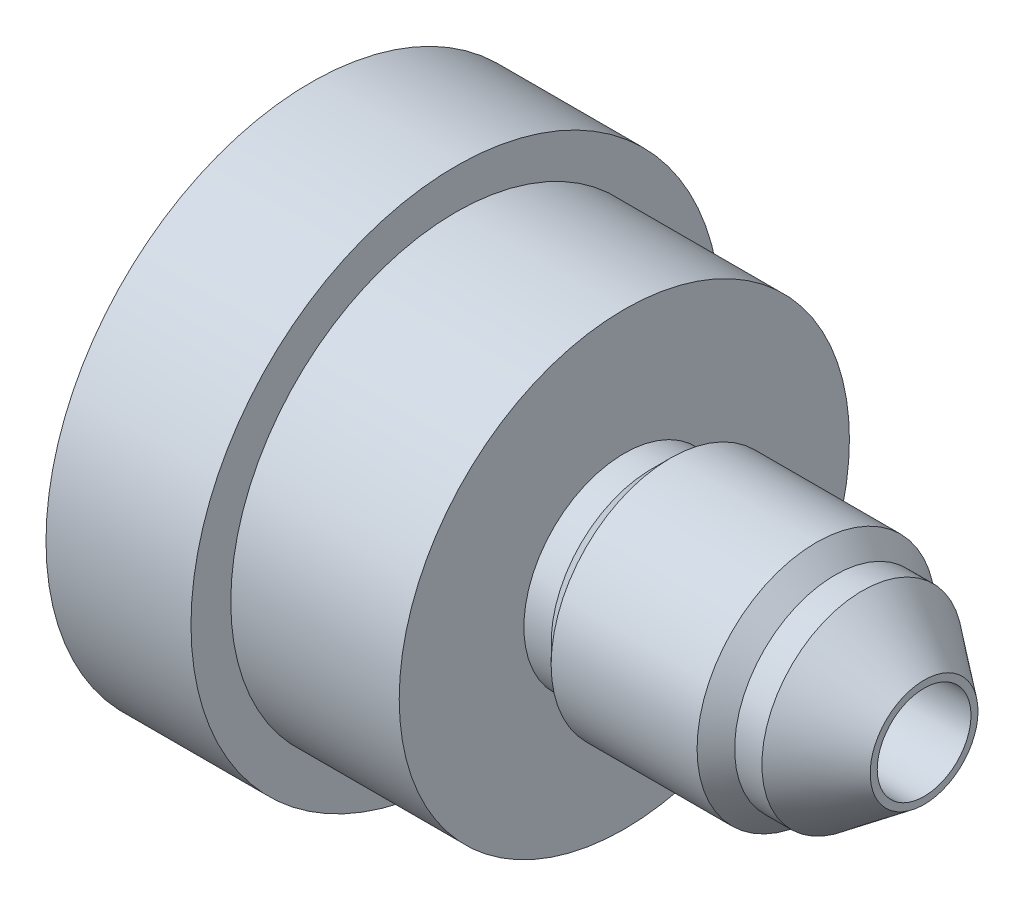
ISO-10303-21;
HEADER;
FILE_DESCRIPTION(('STEP AP214'),'2;1');
FILE_NAME('part.step','',(''),(''),'','','');
FILE_SCHEMA(('AUTOMOTIVE_DESIGN { 1 0 10303 214 1 1 1 1 }'));
ENDSEC;
DATA;
#1=APPLICATION_CONTEXT('core data for automotive mechanical design processes');
#2=APPLICATION_PROTOCOL_DEFINITION('international standard','automotive_design',2000,#1);
#3=PRODUCT_CONTEXT('',#1,'mechanical');
#4=PRODUCT('Part','Part','',(#3));
#5=PRODUCT_RELATED_PRODUCT_CATEGORY('part','',(#4));
#6=PRODUCT_DEFINITION_FORMATION('','',#4);
#7=PRODUCT_DEFINITION_CONTEXT('part definition',#1,'design');
#8=PRODUCT_DEFINITION('design','',#6,#7);
#9=PRODUCT_DEFINITION_SHAPE('','',#8);
#10=(LENGTH_UNIT() NAMED_UNIT(*) SI_UNIT(.MILLI.,.METRE.));
#11=(NAMED_UNIT(*) PLANE_ANGLE_UNIT() SI_UNIT($,.RADIAN.));
#12=(NAMED_UNIT(*) SI_UNIT($,.STERADIAN.) SOLID_ANGLE_UNIT());
#13=UNCERTAINTY_MEASURE_WITH_UNIT(LENGTH_MEASURE(1.E-05),#10,'distance_accuracy_value','');
#14=(GEOMETRIC_REPRESENTATION_CONTEXT(3) GLOBAL_UNCERTAINTY_ASSIGNED_CONTEXT((#13)) GLOBAL_UNIT_ASSIGNED_CONTEXT((#10,
#11,#12)) REPRESENTATION_CONTEXT('',''));
#15=CARTESIAN_POINT('',(0.,0.,0.));
#16=DIRECTION('',(0.,0.,1.));
#17=DIRECTION('',(1.,0.,0.));
#18=AXIS2_PLACEMENT_3D('',#15,#16,#17);
#19=CARTESIAN_POINT('',(-14.2875,0.,0.));
#20=DIRECTION('',(-1.,0.,0.));
#21=DIRECTION('',(0.,0.,1.));
#22=AXIS2_PLACEMENT_3D('',#19,#20,#21);
#23=CYLINDRICAL_SURFACE('',#22,5.55625);
#24=CARTESIAN_POINT('',(2.46318919710472,0.,0.));
#25=DIRECTION('',(1.,0.,0.));
#26=DIRECTION('',(0.,0.,-1.));
#27=AXIS2_PLACEMENT_3D('',#24,#25,#26);
#28=CIRCLE('',#27,5.55625);
#29=CARTESIAN_POINT('',(2.46318919710472,0.,-5.55625));
#30=VERTEX_POINT('',#29);
#31=EDGE_CURVE('E77',#30,#30,#28,.T.);
#32=ORIENTED_EDGE('',*,*,#31,.T.);
#33=EDGE_LOOP('',(#32));
#34=FACE_BOUND('',#33,.T.);
#35=CARTESIAN_POINT('',(9.26411304173335,0.,0.));
#36=DIRECTION('',(1.,0.,0.));
#37=DIRECTION('',(0.,0.,-1.));
#38=AXIS2_PLACEMENT_3D('',#35,#36,#37);
#39=CIRCLE('',#38,5.55625);
#40=CARTESIAN_POINT('',(9.26411304173335,0.,-5.55625));
#41=VERTEX_POINT('',#40);
#42=EDGE_CURVE('E74',#41,#41,#39,.T.);
#43=ORIENTED_EDGE('',*,*,#42,.F.);
#44=EDGE_LOOP('',(#43));
#45=FACE_BOUND('',#44,.T.);
#46=ADVANCED_FACE('F36',(#34,#45),#23,.T.);
#47=CARTESIAN_POINT('',(14.2875,2.1844,0.));
#48=DIRECTION('',(-1.,0.,0.));
#49=DIRECTION('',(0.,0.,1.));
#50=AXIS2_PLACEMENT_3D('',#47,#48,#49);
#51=PLANE('',#50);
#52=CARTESIAN_POINT('',(14.2875,0.,0.));
#53=DIRECTION('',(1.,0.,0.));
#54=DIRECTION('',(0.,0.,-1.));
#55=AXIS2_PLACEMENT_3D('',#52,#53,#54);
#56=CIRCLE('',#55,2.51206);
#57=CARTESIAN_POINT('',(14.2875,0.,-2.51206));
#58=VERTEX_POINT('',#57);
#59=EDGE_CURVE('E65',#58,#58,#56,.T.);
#60=ORIENTED_EDGE('',*,*,#59,.T.);
#61=EDGE_LOOP('',(#60));
#62=FACE_BOUND('',#61,.T.);
#63=CARTESIAN_POINT('',(14.2875,0.,0.));
#64=DIRECTION('',(-1.,0.,0.));
#65=DIRECTION('',(0.,0.,1.));
#66=AXIS2_PLACEMENT_3D('',#63,#64,#65);
#67=CIRCLE('',#66,2.1844);
#68=CARTESIAN_POINT('',(14.2875,0.,2.1844));
#69=VERTEX_POINT('',#68);
#70=EDGE_CURVE('E51',#69,#69,#67,.T.);
#71=ORIENTED_EDGE('',*,*,#70,.T.);
#72=EDGE_LOOP('',(#71));
#73=FACE_BOUND('',#72,.T.);
#74=ADVANCED_FACE('F108',(#62,#73),#51,.F.);
#75=CARTESIAN_POINT('',(-14.2875,0.,0.));
#76=DIRECTION('',(-1.,0.,0.));
#77=DIRECTION('',(0.,0.,1.));
#78=AXIS2_PLACEMENT_3D('',#75,#76,#77);
#79=CYLINDRICAL_SURFACE('',#78,12.3444);
#80=CARTESIAN_POINT('',(-14.2875,0.,0.));
#81=DIRECTION('',(-1.,0.,0.));
#82=DIRECTION('',(0.,0.,1.));
#83=AXIS2_PLACEMENT_3D('',#80,#81,#82);
#84=CIRCLE('',#83,12.3444);
#85=CARTESIAN_POINT('',(-14.2875,0.,12.3444));
#86=VERTEX_POINT('',#85);
#87=EDGE_CURVE('E62',#86,#86,#84,.T.);
#88=ORIENTED_EDGE('',*,*,#87,.F.);
#89=EDGE_LOOP('',(#88));
#90=FACE_BOUND('',#89,.T.);
#91=CARTESIAN_POINT('',(-7.5311,0.,0.));
#92=DIRECTION('',(-1.,0.,0.));
#93=DIRECTION('',(0.,0.,1.));
#94=AXIS2_PLACEMENT_3D('',#91,#92,#93);
#95=CIRCLE('',#94,12.3444);
#96=CARTESIAN_POINT('',(-7.5311,0.,12.3444));
#97=VERTEX_POINT('',#96);
#98=EDGE_CURVE('E10',#97,#97,#95,.T.);
#99=ORIENTED_EDGE('',*,*,#98,.T.);
#100=EDGE_LOOP('',(#99));
#101=FACE_BOUND('',#100,.T.);
#102=ADVANCED_FACE('F38',(#90,#101),#79,.T.);
#103=CARTESIAN_POINT('',(-7.5311,12.3444,0.));
#104=DIRECTION('',(-1.,0.,0.));
#105=DIRECTION('',(0.,0.,1.));
#106=AXIS2_PLACEMENT_3D('',#103,#104,#105);
#107=PLANE('',#106);
#108=ORIENTED_EDGE('',*,*,#98,.F.);
#109=EDGE_LOOP('',(#108));
#110=FACE_BOUND('',#109,.T.);
#111=CARTESIAN_POINT('',(-7.5311,0.,0.));
#112=DIRECTION('',(-1.,0.,0.));
#113=DIRECTION('',(0.,0.,1.));
#114=AXIS2_PLACEMENT_3D('',#111,#112,#113);
#115=CIRCLE('',#114,10.4902);
#116=CARTESIAN_POINT('',(-7.5311,0.,10.4902));
#117=VERTEX_POINT('',#116);
#118=EDGE_CURVE('E43',#117,#117,#115,.T.);
#119=ORIENTED_EDGE('',*,*,#118,.T.);
#120=EDGE_LOOP('',(#119));
#121=FACE_BOUND('',#120,.T.);
#122=ADVANCED_FACE('F102',(#110,#121),#107,.F.);
#123=CARTESIAN_POINT('',(-14.2875,0.,0.));
#124=DIRECTION('',(-1.,0.,0.));
#125=DIRECTION('',(0.,0.,1.));
#126=AXIS2_PLACEMENT_3D('',#123,#124,#125);
#127=CYLINDRICAL_SURFACE('',#126,10.4902);
#128=ORIENTED_EDGE('',*,*,#118,.F.);
#129=EDGE_LOOP('',(#128));
#130=FACE_BOUND('',#129,.T.);
#131=CARTESIAN_POINT('',(0.317500000000002,0.,0.));
#132=DIRECTION('',(-1.,0.,0.));
#133=DIRECTION('',(0.,0.,1.));
#134=AXIS2_PLACEMENT_3D('',#131,#132,#133);
#135=CIRCLE('',#134,10.4902);
#136=CARTESIAN_POINT('',(0.317500000000002,0.,10.4902));
#137=VERTEX_POINT('',#136);
#138=EDGE_CURVE('E47',#137,#137,#135,.T.);
#139=ORIENTED_EDGE('',*,*,#138,.T.);
#140=EDGE_LOOP('',(#139));
#141=FACE_BOUND('',#140,.T.);
#142=ADVANCED_FACE('F92',(#130,#141),#127,.T.);
#143=CARTESIAN_POINT('',(0.317500000000002,10.4902,0.));
#144=DIRECTION('',(-1.,0.,0.));
#145=DIRECTION('',(0.,0.,1.));
#146=AXIS2_PLACEMENT_3D('',#143,#144,#145);
#147=PLANE('',#146);
#148=ORIENTED_EDGE('',*,*,#138,.F.);
#149=EDGE_LOOP('',(#148));
#150=FACE_BOUND('',#149,.T.);
#151=CARTESIAN_POINT('',(0.317500000000033,0.,0.));
#152=DIRECTION('',(1.,0.,0.));
#153=DIRECTION('',(0.,0.,-1.));
#154=AXIS2_PLACEMENT_3D('',#151,#152,#153);
#155=CIRCLE('',#154,4.68056080289531);
#156=CARTESIAN_POINT('',(0.317500000000033,0.,-4.68056080289531));
#157=VERTEX_POINT('',#156);
#158=EDGE_CURVE('E83',#157,#157,#155,.T.);
#159=ORIENTED_EDGE('',*,*,#158,.F.);
#160=EDGE_LOOP('',(#159));
#161=FACE_BOUND('',#160,.T.);
#162=ADVANCED_FACE('F89',(#150,#161),#147,.F.);
#163=CARTESIAN_POINT('',(-14.2875,0.,0.));
#164=DIRECTION('',(-1.,0.,0.));
#165=DIRECTION('',(0.,0.,1.));
#166=AXIS2_PLACEMENT_3D('',#163,#164,#165);
#167=CYLINDRICAL_SURFACE('',#166,2.1844);
#168=ORIENTED_EDGE('',*,*,#70,.F.);
#169=EDGE_LOOP('',(#168));
#170=FACE_BOUND('',#169,.T.);
#171=CARTESIAN_POINT('',(-2.35524378191776,0.,0.));
#172=DIRECTION('',(-1.,0.,0.));
#173=DIRECTION('',(0.,0.,1.));
#174=AXIS2_PLACEMENT_3D('',#171,#172,#173);
#175=CIRCLE('',#174,2.1844);
#176=CARTESIAN_POINT('',(-2.35524378191776,0.,2.1844));
#177=VERTEX_POINT('',#176);
#178=EDGE_CURVE('E56',#177,#177,#175,.T.);
#179=ORIENTED_EDGE('',*,*,#178,.T.);
#180=EDGE_LOOP('',(#179));
#181=FACE_BOUND('',#180,.T.);
#182=ADVANCED_FACE('F91',(#170,#181),#167,.F.);
#183=CARTESIAN_POINT('',(-14.2875,0.,0.));
#184=DIRECTION('',(-1.,0.,0.));
#185=DIRECTION('',(0.,0.,1.));
#186=AXIS2_PLACEMENT_3D('',#183,#184,#185);
#187=CONICAL_SURFACE('',#186,11.176,0.645771823237896);
#188=CARTESIAN_POINT('',(-14.2875,0.,0.));
#189=DIRECTION('',(-1.,0.,0.));
#190=DIRECTION('',(0.,0.,1.));
#191=AXIS2_PLACEMENT_3D('',#188,#189,#190);
#192=CIRCLE('',#191,11.176);
#193=CARTESIAN_POINT('',(-14.2875,0.,11.176));
#194=VERTEX_POINT('',#193);
#195=EDGE_CURVE('E59',#194,#194,#192,.T.);
#196=CARTESIAN_POINT('',(-2.35524378191776,0.,2.1844));
#197=CARTESIAN_POINT('',(-2.47953811752279,0.,2.2780625));
#198=CARTESIAN_POINT('',(-2.60383245312781,0.,2.371725));
#199=CARTESIAN_POINT('',(-2.85242112433786,0.,2.55905));
#200=CARTESIAN_POINT('',(-2.97671545994288,0.,2.6527125));
#201=CARTESIAN_POINT('',(-3.22530413115293,0.,2.8400375));
#202=CARTESIAN_POINT('',(-3.34959846675795,0.,2.9337));
#203=CARTESIAN_POINT('',(-3.598187137968,0.,3.121025));
#204=CARTESIAN_POINT('',(-3.72248147357302,0.,3.2146875));
#205=CARTESIAN_POINT('',(-3.97107014478307,0.,3.4020125));
#206=CARTESIAN_POINT('',(-4.09536448038809,0.,3.495675));
#207=CARTESIAN_POINT('',(-4.34395315159814,0.,3.683));
#208=CARTESIAN_POINT('',(-4.46824748720316,0.,3.7766625));
#209=CARTESIAN_POINT('',(-4.71683615841321,0.,3.9639875));
#210=CARTESIAN_POINT('',(-4.84113049401823,0.,4.05765));
#211=CARTESIAN_POINT('',(-5.08971916522828,0.,4.244975));
#212=CARTESIAN_POINT('',(-5.2140135008333,0.,4.3386375));
#213=CARTESIAN_POINT('',(-5.46260217204335,0.,4.5259625));
#214=CARTESIAN_POINT('',(-5.58689650764837,0.,4.619625));
#215=CARTESIAN_POINT('',(-5.83548517885842,0.,4.80695));
#216=CARTESIAN_POINT('',(-5.95977951446344,0.,4.9006125));
#217=CARTESIAN_POINT('',(-6.20836818567349,0.,5.0879375));
#218=CARTESIAN_POINT('',(-6.33266252127851,0.,5.1816));
#219=CARTESIAN_POINT('',(-6.58125119248856,0.,5.368925));
#220=CARTESIAN_POINT('',(-6.70554552809358,0.,5.4625875));
#221=CARTESIAN_POINT('',(-6.95413419930363,0.,5.6499125));
#222=CARTESIAN_POINT('',(-7.07842853490865,0.,5.743575));
#223=CARTESIAN_POINT('',(-7.3270172061187,0.,5.9309));
#224=CARTESIAN_POINT('',(-7.45131154172372,0.,6.0245625));
#225=CARTESIAN_POINT('',(-7.69990021293376,0.,6.2118875));
#226=CARTESIAN_POINT('',(-7.82419454853879,0.,6.30555));
#227=CARTESIAN_POINT('',(-8.07278321974883,0.,6.492875));
#228=CARTESIAN_POINT('',(-8.19707755535386,0.,6.5865375));
#229=CARTESIAN_POINT('',(-8.4456662265639,0.,6.7738625));
#230=CARTESIAN_POINT('',(-8.56996056216893,0.,6.867525));
#231=CARTESIAN_POINT('',(-8.81854923337897,0.,7.05485));
#232=CARTESIAN_POINT('',(-8.942843568984,0.,7.1485125));
#233=CARTESIAN_POINT('',(-9.19143224019404,0.,7.3358375));
#234=CARTESIAN_POINT('',(-9.31572657579907,0.,7.4295));
#235=CARTESIAN_POINT('',(-9.56431524700911,0.,7.616825));
#236=CARTESIAN_POINT('',(-9.68860958261414,0.,7.7104875));
#237=CARTESIAN_POINT('',(-9.93719825382419,0.,7.8978125));
#238=CARTESIAN_POINT('',(-10.0614925894292,0.,7.991475));
#239=CARTESIAN_POINT('',(-10.3100812606393,0.,8.1788));
#240=CARTESIAN_POINT('',(-10.4343755962443,0.,8.2724625));
#241=CARTESIAN_POINT('',(-10.6829642674543,0.,8.4597875));
#242=CARTESIAN_POINT('',(-10.8072586030593,0.,8.55345));
#243=CARTESIAN_POINT('',(-11.0558472742694,0.,8.740775));
#244=CARTESIAN_POINT('',(-11.1801416098744,0.,8.8344375));
#245=CARTESIAN_POINT('',(-11.4287302810845,0.,9.0217625));
#246=CARTESIAN_POINT('',(-11.5530246166895,0.,9.115425));
#247=CARTESIAN_POINT('',(-11.8016132878995,0.,9.30275));
#248=CARTESIAN_POINT('',(-11.9259076235046,0.,9.3964125));
#249=CARTESIAN_POINT('',(-12.1744962947146,0.,9.5837375));
#250=CARTESIAN_POINT('',(-12.2987906303196,0.,9.6774));
#251=CARTESIAN_POINT('',(-12.5473793015297,0.,9.864725));
#252=CARTESIAN_POINT('',(-12.6716736371347,0.,9.9583875));
#253=CARTESIAN_POINT('',(-12.9202623083447,0.,10.1457125));
#254=CARTESIAN_POINT('',(-13.0445566439498,0.,10.239375));
#255=CARTESIAN_POINT('',(-13.2931453151598,0.,10.4267));
#256=CARTESIAN_POINT('',(-13.4174396507648,0.,10.5203625));
#257=CARTESIAN_POINT('',(-13.6660283219749,0.,10.7076875));
#258=CARTESIAN_POINT('',(-13.7903226575799,0.,10.80135));
#259=CARTESIAN_POINT('',(-14.03891132879,0.,10.988675));
#260=CARTESIAN_POINT('',(-14.163205664395,0.,11.0823375));
#261=CARTESIAN_POINT('',(-14.2875,0.,11.176));
#262=B_SPLINE_CURVE_WITH_KNOTS('',3,(#196,#197,#198,#199,#200,#201,#202,#203,#204,#205,#206,
#207,#208,#209,#210,#211,#212,#213,#214,#215,#216,#217,#218,#219,#220,#221,#222,#223,#224,#225,
#226,#227,#228,#229,#230,#231,#232,#233,#234,#235,#236,#237,#238,#239,#240,#241,#242,#243,#244,
#245,#246,#247,#248,#249,#250,#251,#252,#253,#254,#255,#256,#257,#258,#259,#260,#261),
.UNSPECIFIED.,.F.,.F.,(4,2,2,2,2,2,2,2,2,2,2,2,2,2,2,2,2,2,2,2,2,2,2,2,2,2,2,2,2,2,2,2,4),(0.,
0.466900109153658,0.933800218307317,1.40070032746097,1.86760043661463,2.33450054576829,
2.80140065492195,3.2683007640756,3.73520087322926,4.20210098238292,4.66900109153658,
5.13590120069024,5.60280130984389,6.06970141899755,6.53660152815121,7.00350163730486,
7.47040174645852,7.93730185561218,8.40420196476584,8.8711020739195,9.33800218307315,
9.80490229222681,10.2718024013805,10.7387025105341,11.2056026196878,11.6725027288414,
12.1394028379951,12.6063029471488,13.0732030563024,13.5401031654561,14.0070032746097,
14.4739033837634,14.940803492917),.UNSPECIFIED.);
#263=EDGE_CURVE('BSEAM99',#177,#194,#262,.T.);
#264=ORIENTED_EDGE('',*,*,#178,.F.);
#265=ORIENTED_EDGE('',*,*,#195,.T.);
#266=ORIENTED_EDGE('',*,*,#263,.T.);
#267=ORIENTED_EDGE('',*,*,#263,.F.);
#268=EDGE_LOOP('',(#264,#266,#265,#267));
#269=FACE_BOUND('',#268,.T.);
#270=ADVANCED_FACE('F99',(#269),#187,.F.);
#271=CARTESIAN_POINT('',(-14.2875,12.3444,0.));
#272=DIRECTION('',(1.,0.,0.));
#273=DIRECTION('',(0.,0.,-1.));
#274=AXIS2_PLACEMENT_3D('',#271,#272,#273);
#275=PLANE('',#274);
#276=ORIENTED_EDGE('',*,*,#195,.F.);
#277=EDGE_LOOP('',(#276));
#278=FACE_BOUND('',#277,.T.);
#279=ORIENTED_EDGE('',*,*,#87,.T.);
#280=EDGE_LOOP('',(#279));
#281=FACE_BOUND('',#280,.T.);
#282=ADVANCED_FACE('F119',(#278,#281),#275,.F.);
#283=CARTESIAN_POINT('',(11.409802238838,0.,0.));
#284=DIRECTION('',(-1.,0.,0.));
#285=DIRECTION('',(0.,0.,1.));
#286=AXIS2_PLACEMENT_3D('',#283,#284,#285);
#287=CONICAL_SURFACE('',#286,4.68056080289531,0.645771823237896);
#288=ORIENTED_EDGE('',*,*,#59,.F.);
#289=EDGE_LOOP('',(#288));
#290=FACE_BOUND('',#289,.T.);
#291=CARTESIAN_POINT('',(11.409802238838,0.,0.));
#292=DIRECTION('',(1.,0.,0.));
#293=DIRECTION('',(0.,0.,-1.));
#294=AXIS2_PLACEMENT_3D('',#291,#292,#293);
#295=CIRCLE('',#294,4.68056080289531);
#296=CARTESIAN_POINT('',(11.409802238838,0.,-4.68056080289531));
#297=VERTEX_POINT('',#296);
#298=EDGE_CURVE('E68',#297,#297,#295,.T.);
#299=ORIENTED_EDGE('',*,*,#298,.T.);
#300=EDGE_LOOP('',(#299));
#301=FACE_BOUND('',#300,.T.);
#302=ADVANCED_FACE('F123',(#290,#301),#287,.T.);
#303=CARTESIAN_POINT('',(0.,0.,0.));
#304=DIRECTION('',(1.,0.,0.));
#305=DIRECTION('',(0.,0.,-1.));
#306=AXIS2_PLACEMENT_3D('',#303,#304,#305);
#307=CYLINDRICAL_SURFACE('',#306,4.68056080289531);
#308=ORIENTED_EDGE('',*,*,#298,.F.);
#309=EDGE_LOOP('',(#308));
#310=FACE_BOUND('',#309,.T.);
#311=CARTESIAN_POINT('',(10.139802238838,0.,0.));
#312=DIRECTION('',(1.,0.,0.));
#313=DIRECTION('',(0.,0.,-1.));
#314=AXIS2_PLACEMENT_3D('',#311,#312,#313);
#315=CIRCLE('',#314,4.68056080289531);
#316=CARTESIAN_POINT('',(10.139802238838,0.,-4.68056080289531));
#317=VERTEX_POINT('',#316);
#318=EDGE_CURVE('E71',#317,#317,#315,.T.);
#319=ORIENTED_EDGE('',*,*,#318,.T.);
#320=EDGE_LOOP('',(#319));
#321=FACE_BOUND('',#320,.T.);
#322=ADVANCED_FACE('F127',(#310,#321),#307,.T.);
#323=CARTESIAN_POINT('',(9.26411304173335,0.,0.));
#324=DIRECTION('',(-1.,0.,0.));
#325=DIRECTION('',(0.,0.,1.));
#326=AXIS2_PLACEMENT_3D('',#323,#324,#325);
#327=CONICAL_SURFACE('',#326,5.55625,0.785398163397448);
#328=ORIENTED_EDGE('',*,*,#42,.T.);
#329=EDGE_LOOP('',(#328));
#330=FACE_BOUND('',#329,.T.);
#331=ORIENTED_EDGE('',*,*,#318,.F.);
#332=EDGE_LOOP('',(#331));
#333=FACE_BOUND('',#332,.T.);
#334=ADVANCED_FACE('F131',(#330,#333),#327,.T.);
#335=CARTESIAN_POINT('',(1.58750000000003,0.,0.));
#336=DIRECTION('',(1.,0.,0.));
#337=DIRECTION('',(0.,0.,-1.));
#338=AXIS2_PLACEMENT_3D('',#335,#336,#337);
#339=CONICAL_SURFACE('',#338,4.68056080289531,0.78539816339745);
#340=ORIENTED_EDGE('',*,*,#31,.F.);
#341=EDGE_LOOP('',(#340));
#342=FACE_BOUND('',#341,.T.);
#343=CARTESIAN_POINT('',(1.58750000000003,0.,0.));
#344=DIRECTION('',(1.,0.,0.));
#345=DIRECTION('',(0.,0.,-1.));
#346=AXIS2_PLACEMENT_3D('',#343,#344,#345);
#347=CIRCLE('',#346,4.68056080289531);
#348=CARTESIAN_POINT('',(1.58750000000003,0.,-4.68056080289531));
#349=VERTEX_POINT('',#348);
#350=EDGE_CURVE('E80',#349,#349,#347,.T.);
#351=ORIENTED_EDGE('',*,*,#350,.T.);
#352=EDGE_LOOP('',(#351));
#353=FACE_BOUND('',#352,.T.);
#354=ADVANCED_FACE('F135',(#342,#353),#339,.T.);
#355=CARTESIAN_POINT('',(0.,0.,0.));
#356=DIRECTION('',(1.,0.,0.));
#357=DIRECTION('',(0.,0.,-1.));
#358=AXIS2_PLACEMENT_3D('',#355,#356,#357);
#359=CYLINDRICAL_SURFACE('',#358,4.68056080289531);
#360=ORIENTED_EDGE('',*,*,#350,.F.);
#361=EDGE_LOOP('',(#360));
#362=FACE_BOUND('',#361,.T.);
#363=ORIENTED_EDGE('',*,*,#158,.T.);
#364=EDGE_LOOP('',(#363));
#365=FACE_BOUND('',#364,.T.);
#366=ADVANCED_FACE('F87',(#362,#365),#359,.T.);
#367=CLOSED_SHELL('',(#46,#74,#102,#122,#142,#162,#182,#270,#282,#302,#322,#334,#354,#366));
#368=MANIFOLD_SOLID_BREP('B2',#367);
#369=ADVANCED_BREP_SHAPE_REPRESENTATION('',(#18,#368),#14);
#370=SHAPE_DEFINITION_REPRESENTATION(#9,#369);
ENDSEC;
END-ISO-10303-21;
